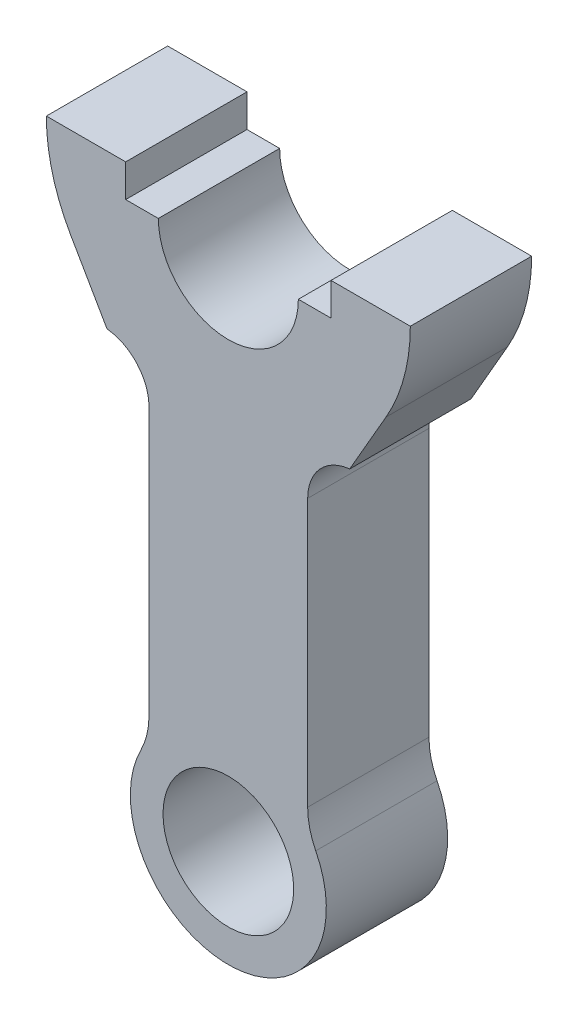
ISO-10303-21;
HEADER;
FILE_DESCRIPTION(('STEP AP214'),'2;1');
FILE_NAME('part.step','',(''),(''),'','','');
FILE_SCHEMA(('AUTOMOTIVE_DESIGN { 1 0 10303 214 1 1 1 1 }'));
ENDSEC;
DATA;
#1=APPLICATION_CONTEXT('core data for automotive mechanical design processes');
#2=APPLICATION_PROTOCOL_DEFINITION('international standard','automotive_design',2000,#1);
#3=PRODUCT_CONTEXT('',#1,'mechanical');
#4=PRODUCT('Part','Part','',(#3));
#5=PRODUCT_RELATED_PRODUCT_CATEGORY('part','',(#4));
#6=PRODUCT_DEFINITION_FORMATION('','',#4);
#7=PRODUCT_DEFINITION_CONTEXT('part definition',#1,'design');
#8=PRODUCT_DEFINITION('design','',#6,#7);
#9=PRODUCT_DEFINITION_SHAPE('','',#8);
#10=(LENGTH_UNIT() NAMED_UNIT(*) SI_UNIT(.MILLI.,.METRE.));
#11=(NAMED_UNIT(*) PLANE_ANGLE_UNIT() SI_UNIT($,.RADIAN.));
#12=(NAMED_UNIT(*) SI_UNIT($,.STERADIAN.) SOLID_ANGLE_UNIT());
#13=UNCERTAINTY_MEASURE_WITH_UNIT(LENGTH_MEASURE(1.E-05),#10,'distance_accuracy_value','');
#14=(GEOMETRIC_REPRESENTATION_CONTEXT(3) GLOBAL_UNCERTAINTY_ASSIGNED_CONTEXT((#13)) GLOBAL_UNIT_ASSIGNED_CONTEXT((#10,
#11,#12)) REPRESENTATION_CONTEXT('',''));
#15=CARTESIAN_POINT('',(0.,0.,0.));
#16=DIRECTION('',(0.,0.,1.));
#17=DIRECTION('',(1.,0.,0.));
#18=AXIS2_PLACEMENT_3D('',#15,#16,#17);
#19=CARTESIAN_POINT('',(0.,0.,13.));
#20=DIRECTION('',(0.,0.,1.));
#21=DIRECTION('',(1.,0.,0.));
#22=AXIS2_PLACEMENT_3D('',#19,#20,#21);
#23=PLANE('',#22);
#24=CARTESIAN_POINT('',(0.,0.,13.));
#25=DIRECTION('',(0.,0.,1.));
#26=DIRECTION('',(1.,0.,0.));
#27=AXIS2_PLACEMENT_3D('',#24,#25,#26);
#28=CIRCLE('',#27,39.);
#29=CARTESIAN_POINT('',(33.7957975443534,-19.463917086267,13.));
#30=VERTEX_POINT('',#29);
#31=CARTESIAN_POINT('',(39.,0.,13.));
#32=VERTEX_POINT('',#31);
#33=EDGE_CURVE('E177',#30,#32,#28,.T.);
#34=ORIENTED_EDGE('',*,*,#33,.T.);
#35=DIRECTION('',(-1.,0.,0.));
#36=VECTOR('',#35,1.);
#37=CARTESIAN_POINT('',(39.,0.,13.));
#38=LINE('',#37,#36);
#39=CARTESIAN_POINT('',(22.,0.,13.));
#40=VERTEX_POINT('',#39);
#41=EDGE_CURVE('E166',#32,#40,#38,.T.);
#42=ORIENTED_EDGE('',*,*,#41,.T.);
#43=DIRECTION('',(0.,-1.,0.));
#44=VECTOR('',#43,1.);
#45=CARTESIAN_POINT('',(22.,0.,13.));
#46=LINE('',#45,#44);
#47=CARTESIAN_POINT('',(22.,-7.,13.));
#48=VERTEX_POINT('',#47);
#49=EDGE_CURVE('E176',#40,#48,#46,.T.);
#50=ORIENTED_EDGE('',*,*,#49,.T.);
#51=DIRECTION('',(-1.,0.,0.));
#52=VECTOR('',#51,1.);
#53=CARTESIAN_POINT('',(22.,-7.,13.));
#54=LINE('',#53,#52);
#55=CARTESIAN_POINT('',(15.,-7.,13.));
#56=VERTEX_POINT('',#55);
#57=EDGE_CURVE('E292',#48,#56,#54,.T.);
#58=ORIENTED_EDGE('',*,*,#57,.T.);
#59=CARTESIAN_POINT('',(0.,-7.,13.));
#60=DIRECTION('',(0.,0.,-1.));
#61=DIRECTION('',(-1.,0.,0.));
#62=AXIS2_PLACEMENT_3D('',#59,#60,#61);
#63=CIRCLE('',#62,15.);
#64=CARTESIAN_POINT('',(-15.,-7.,13.));
#65=VERTEX_POINT('',#64);
#66=EDGE_CURVE('E337',#56,#65,#63,.T.);
#67=ORIENTED_EDGE('',*,*,#66,.T.);
#68=DIRECTION('',(-1.,0.,0.));
#69=VECTOR('',#68,1.);
#70=CARTESIAN_POINT('',(-22.,-7.,13.));
#71=LINE('',#70,#69);
#72=CARTESIAN_POINT('',(-22.,-7.,13.));
#73=VERTEX_POINT('',#72);
#74=EDGE_CURVE('E341',#65,#73,#71,.T.);
#75=ORIENTED_EDGE('',*,*,#74,.T.);
#76=DIRECTION('',(0.,1.,0.));
#77=VECTOR('',#76,1.);
#78=CARTESIAN_POINT('',(-22.,-7.,13.));
#79=LINE('',#78,#77);
#80=CARTESIAN_POINT('',(-22.,0.,13.));
#81=VERTEX_POINT('',#80);
#82=EDGE_CURVE('E322',#73,#81,#79,.T.);
#83=ORIENTED_EDGE('',*,*,#82,.T.);
#84=DIRECTION('',(-1.,0.,0.));
#85=VECTOR('',#84,1.);
#86=CARTESIAN_POINT('',(-22.,0.,13.));
#87=LINE('',#86,#85);
#88=CARTESIAN_POINT('',(-39.,0.,13.));
#89=VERTEX_POINT('',#88);
#90=EDGE_CURVE('E319',#81,#89,#87,.T.);
#91=ORIENTED_EDGE('',*,*,#90,.T.);
#92=CARTESIAN_POINT('',(0.,0.,13.));
#93=DIRECTION('',(0.,0.,1.));
#94=DIRECTION('',(1.,0.,0.));
#95=AXIS2_PLACEMENT_3D('',#92,#93,#94);
#96=CIRCLE('',#95,39.);
#97=CARTESIAN_POINT('',(-33.7957975443534,-19.463917086267,13.));
#98=VERTEX_POINT('',#97);
#99=EDGE_CURVE('E318',#89,#98,#96,.T.);
#100=ORIENTED_EDGE('',*,*,#99,.T.);
#101=DIRECTION('',(0.49907479708377,-0.866558911393676,0.));
#102=VECTOR('',#101,1.);
#103=CARTESIAN_POINT('',(-33.7957975443534,-19.463917086267,13.));
#104=LINE('',#103,#102);
#105=CARTESIAN_POINT('',(-26.,-33.,13.));
#106=VERTEX_POINT('',#105);
#107=EDGE_CURVE('E208',#98,#106,#104,.T.);
#108=ORIENTED_EDGE('',*,*,#107,.T.);
#109=CARTESIAN_POINT('',(-27.,-42.9498743710662,13.));
#110=DIRECTION('',(0.,0.,1.));
#111=DIRECTION('',(1.,0.,0.));
#112=AXIS2_PLACEMENT_3D('',#109,#110,#111);
#113=CIRCLE('',#112,10.);
#114=CARTESIAN_POINT('',(-17.,-42.9498743710662,13.));
#115=VERTEX_POINT('',#114);
#116=EDGE_CURVE('E202',#106,#115,#113,.F.);
#117=ORIENTED_EDGE('',*,*,#116,.T.);
#118=DIRECTION('',(0.,-1.,0.));
#119=VECTOR('',#118,1.);
#120=CARTESIAN_POINT('',(-17.,-33.,13.));
#121=LINE('',#120,#119);
#122=CARTESIAN_POINT('',(-17.,-100.266799469319,13.));
#123=VERTEX_POINT('',#122);
#124=EDGE_CURVE('E205',#115,#123,#121,.T.);
#125=ORIENTED_EDGE('',*,*,#124,.T.);
#126=CARTESIAN_POINT('',(-33.,-100.266799469319,13.));
#127=DIRECTION('',(0.,0.,-1.));
#128=DIRECTION('',(-1.,0.,0.));
#129=AXIS2_PLACEMENT_3D('',#126,#127,#128);
#130=CIRCLE('',#129,16.);
#131=CARTESIAN_POINT('',(-18.7297297297297,-107.502778077181,13.));
#132=VERTEX_POINT('',#131);
#133=EDGE_CURVE('E219',#123,#132,#130,.T.);
#134=ORIENTED_EDGE('',*,*,#133,.T.);
#135=CARTESIAN_POINT('',(0.,-117.,13.));
#136=DIRECTION('',(0.,0.,1.));
#137=DIRECTION('',(1.,0.,0.));
#138=AXIS2_PLACEMENT_3D('',#135,#136,#137);
#139=CIRCLE('',#138,21.);
#140=CARTESIAN_POINT('',(18.7297297297297,-107.502778077181,13.));
#141=VERTEX_POINT('',#140);
#142=EDGE_CURVE('E327',#132,#141,#139,.T.);
#143=ORIENTED_EDGE('',*,*,#142,.T.);
#144=CARTESIAN_POINT('',(33.,-100.266799469319,13.));
#145=DIRECTION('',(0.,0.,-1.));
#146=DIRECTION('',(1.,0.,0.));
#147=AXIS2_PLACEMENT_3D('',#144,#145,#146);
#148=CIRCLE('',#147,16.);
#149=CARTESIAN_POINT('',(17.,-100.266799469319,13.));
#150=VERTEX_POINT('',#149);
#151=EDGE_CURVE('E329',#141,#150,#148,.T.);
#152=ORIENTED_EDGE('',*,*,#151,.T.);
#153=DIRECTION('',(0.,1.,0.));
#154=VECTOR('',#153,1.);
#155=CARTESIAN_POINT('',(17.,-33.,13.));
#156=LINE('',#155,#154);
#157=CARTESIAN_POINT('',(17.,-42.9498743710662,13.));
#158=VERTEX_POINT('',#157);
#159=EDGE_CURVE('E331',#150,#158,#156,.T.);
#160=ORIENTED_EDGE('',*,*,#159,.T.);
#161=CARTESIAN_POINT('',(27.,-42.9498743710662,13.));
#162=DIRECTION('',(0.,0.,1.));
#163=DIRECTION('',(1.,0.,0.));
#164=AXIS2_PLACEMENT_3D('',#161,#162,#163);
#165=CIRCLE('',#164,10.);
#166=CARTESIAN_POINT('',(26.,-33.,13.));
#167=VERTEX_POINT('',#166);
#168=EDGE_CURVE('E11',#158,#167,#165,.F.);
#169=ORIENTED_EDGE('',*,*,#168,.T.);
#170=DIRECTION('',(0.499074797083771,0.866558911393676,0.));
#171=VECTOR('',#170,1.);
#172=CARTESIAN_POINT('',(33.7957975443534,-19.463917086267,13.));
#173=LINE('',#172,#171);
#174=EDGE_CURVE('E182',#167,#30,#173,.T.);
#175=ORIENTED_EDGE('',*,*,#174,.T.);
#176=EDGE_LOOP('',(#34,#42,#50,#58,#67,#75,#83,#91,#100,#108,#117,#125,#134,#143,#152,#160,#169,#175));
#177=FACE_BOUND('',#176,.T.);
#178=CARTESIAN_POINT('',(0.,-117.,13.));
#179=DIRECTION('',(0.,0.,1.));
#180=DIRECTION('',(1.,0.,0.));
#181=AXIS2_PLACEMENT_3D('',#178,#179,#180);
#182=CIRCLE('',#181,14.);
#183=CARTESIAN_POINT('',(-14.,-117.,13.));
#184=VERTEX_POINT('',#183);
#185=EDGE_CURVE('E334',#184,#184,#182,.T.);
#186=ORIENTED_EDGE('',*,*,#185,.F.);
#187=EDGE_LOOP('',(#186));
#188=FACE_BOUND('',#187,.T.);
#189=ADVANCED_FACE('F41',(#177,#188),#23,.T.);
#190=CARTESIAN_POINT('',(0.,0.,-13.));
#191=DIRECTION('',(0.,0.,1.));
#192=DIRECTION('',(1.,0.,0.));
#193=AXIS2_PLACEMENT_3D('',#190,#191,#192);
#194=PLANE('',#193);
#195=CARTESIAN_POINT('',(0.,0.,-13.));
#196=DIRECTION('',(0.,0.,1.));
#197=DIRECTION('',(1.,0.,0.));
#198=AXIS2_PLACEMENT_3D('',#195,#196,#197);
#199=CIRCLE('',#198,39.);
#200=CARTESIAN_POINT('',(33.7957975443534,-19.463917086267,-13.));
#201=VERTEX_POINT('',#200);
#202=CARTESIAN_POINT('',(39.,0.,-13.));
#203=VERTEX_POINT('',#202);
#204=EDGE_CURVE('E190',#201,#203,#199,.T.);
#205=ORIENTED_EDGE('',*,*,#204,.F.);
#206=DIRECTION('',(0.499074797083771,0.866558911393676,0.));
#207=VECTOR('',#206,1.);
#208=CARTESIAN_POINT('',(33.7957975443534,-19.463917086267,-13.));
#209=LINE('',#208,#207);
#210=CARTESIAN_POINT('',(26.,-33.,-13.));
#211=VERTEX_POINT('',#210);
#212=EDGE_CURVE('E186',#211,#201,#209,.T.);
#213=ORIENTED_EDGE('',*,*,#212,.F.);
#214=CARTESIAN_POINT('',(27.,-42.9498743710662,-13.));
#215=DIRECTION('',(0.,0.,1.));
#216=DIRECTION('',(1.,0.,0.));
#217=AXIS2_PLACEMENT_3D('',#214,#215,#216);
#218=CIRCLE('',#217,10.);
#219=CARTESIAN_POINT('',(17.,-42.9498743710662,-13.));
#220=VERTEX_POINT('',#219);
#221=EDGE_CURVE('E49',#211,#220,#218,.T.);
#222=ORIENTED_EDGE('',*,*,#221,.T.);
#223=DIRECTION('',(0.,1.,0.));
#224=VECTOR('',#223,1.);
#225=CARTESIAN_POINT('',(17.,-33.,-13.));
#226=LINE('',#225,#224);
#227=CARTESIAN_POINT('',(17.,-100.266799469319,-13.));
#228=VERTEX_POINT('',#227);
#229=EDGE_CURVE('E250',#228,#220,#226,.T.);
#230=ORIENTED_EDGE('',*,*,#229,.F.);
#231=CARTESIAN_POINT('',(33.,-100.266799469319,-13.));
#232=DIRECTION('',(0.,0.,-1.));
#233=DIRECTION('',(1.,0.,0.));
#234=AXIS2_PLACEMENT_3D('',#231,#232,#233);
#235=CIRCLE('',#234,16.);
#236=CARTESIAN_POINT('',(18.7297297297297,-107.502778077181,-13.));
#237=VERTEX_POINT('',#236);
#238=EDGE_CURVE('E248',#237,#228,#235,.T.);
#239=ORIENTED_EDGE('',*,*,#238,.F.);
#240=CARTESIAN_POINT('',(0.,-117.,-13.));
#241=DIRECTION('',(0.,0.,1.));
#242=DIRECTION('',(-1.,0.,0.));
#243=AXIS2_PLACEMENT_3D('',#240,#241,#242);
#244=CIRCLE('',#243,21.);
#245=CARTESIAN_POINT('',(-18.7297297297297,-107.502778077181,-13.));
#246=VERTEX_POINT('',#245);
#247=EDGE_CURVE('E246',#246,#237,#244,.T.);
#248=ORIENTED_EDGE('',*,*,#247,.F.);
#249=CARTESIAN_POINT('',(-33.,-100.266799469319,-13.));
#250=DIRECTION('',(0.,0.,-1.));
#251=DIRECTION('',(-1.,0.,0.));
#252=AXIS2_PLACEMENT_3D('',#249,#250,#251);
#253=CIRCLE('',#252,16.);
#254=CARTESIAN_POINT('',(-17.,-100.266799469319,-13.));
#255=VERTEX_POINT('',#254);
#256=EDGE_CURVE('E238',#255,#246,#253,.T.);
#257=ORIENTED_EDGE('',*,*,#256,.F.);
#258=DIRECTION('',(0.,-1.,0.));
#259=VECTOR('',#258,1.);
#260=CARTESIAN_POINT('',(-17.,-33.,-13.));
#261=LINE('',#260,#259);
#262=CARTESIAN_POINT('',(-17.,-42.9498743710662,-13.));
#263=VERTEX_POINT('',#262);
#264=EDGE_CURVE('E230',#263,#255,#261,.T.);
#265=ORIENTED_EDGE('',*,*,#264,.F.);
#266=CARTESIAN_POINT('',(-27.,-42.9498743710662,-13.));
#267=DIRECTION('',(0.,0.,1.));
#268=DIRECTION('',(1.,0.,0.));
#269=AXIS2_PLACEMENT_3D('',#266,#267,#268);
#270=CIRCLE('',#269,10.);
#271=CARTESIAN_POINT('',(-26.,-33.,-13.));
#272=VERTEX_POINT('',#271);
#273=EDGE_CURVE('E200',#263,#272,#270,.T.);
#274=ORIENTED_EDGE('',*,*,#273,.T.);
#275=DIRECTION('',(0.49907479708377,-0.866558911393676,0.));
#276=VECTOR('',#275,1.);
#277=CARTESIAN_POINT('',(-33.7957975443534,-19.463917086267,-13.));
#278=LINE('',#277,#276);
#279=CARTESIAN_POINT('',(-33.7957975443534,-19.463917086267,-13.));
#280=VERTEX_POINT('',#279);
#281=EDGE_CURVE('E228',#280,#272,#278,.T.);
#282=ORIENTED_EDGE('',*,*,#281,.F.);
#283=CARTESIAN_POINT('',(0.,0.,-13.));
#284=DIRECTION('',(0.,0.,1.));
#285=DIRECTION('',(1.,0.,0.));
#286=AXIS2_PLACEMENT_3D('',#283,#284,#285);
#287=CIRCLE('',#286,39.);
#288=CARTESIAN_POINT('',(-39.,0.,-13.));
#289=VERTEX_POINT('',#288);
#290=EDGE_CURVE('E236',#289,#280,#287,.T.);
#291=ORIENTED_EDGE('',*,*,#290,.F.);
#292=DIRECTION('',(-1.,0.,0.));
#293=VECTOR('',#292,1.);
#294=CARTESIAN_POINT('',(-22.,0.,-13.));
#295=LINE('',#294,#293);
#296=CARTESIAN_POINT('',(-22.,0.,-13.));
#297=VERTEX_POINT('',#296);
#298=EDGE_CURVE('E240',#297,#289,#295,.T.);
#299=ORIENTED_EDGE('',*,*,#298,.F.);
#300=DIRECTION('',(0.,1.,0.));
#301=VECTOR('',#300,1.);
#302=CARTESIAN_POINT('',(-22.,-7.,-13.));
#303=LINE('',#302,#301);
#304=CARTESIAN_POINT('',(-22.,-7.,-13.));
#305=VERTEX_POINT('',#304);
#306=EDGE_CURVE('E307',#305,#297,#303,.T.);
#307=ORIENTED_EDGE('',*,*,#306,.F.);
#308=DIRECTION('',(-1.,0.,0.));
#309=VECTOR('',#308,1.);
#310=CARTESIAN_POINT('',(-22.,-7.,-13.));
#311=LINE('',#310,#309);
#312=CARTESIAN_POINT('',(-15.,-7.,-13.));
#313=VERTEX_POINT('',#312);
#314=EDGE_CURVE('E300',#313,#305,#311,.T.);
#315=ORIENTED_EDGE('',*,*,#314,.F.);
#316=CARTESIAN_POINT('',(0.,-7.,-13.));
#317=DIRECTION('',(0.,0.,-1.));
#318=DIRECTION('',(-1.,0.,0.));
#319=AXIS2_PLACEMENT_3D('',#316,#317,#318);
#320=CIRCLE('',#319,15.);
#321=CARTESIAN_POINT('',(15.,-7.,-13.));
#322=VERTEX_POINT('',#321);
#323=EDGE_CURVE('E298',#322,#313,#320,.T.);
#324=ORIENTED_EDGE('',*,*,#323,.F.);
#325=DIRECTION('',(-1.,0.,0.));
#326=VECTOR('',#325,1.);
#327=CARTESIAN_POINT('',(22.,-7.,-13.));
#328=LINE('',#327,#326);
#329=CARTESIAN_POINT('',(22.,-7.,-13.));
#330=VERTEX_POINT('',#329);
#331=EDGE_CURVE('E291',#330,#322,#328,.T.);
#332=ORIENTED_EDGE('',*,*,#331,.F.);
#333=DIRECTION('',(0.,-1.,0.));
#334=VECTOR('',#333,1.);
#335=CARTESIAN_POINT('',(22.,0.,-13.));
#336=LINE('',#335,#334);
#337=CARTESIAN_POINT('',(22.,0.,-13.));
#338=VERTEX_POINT('',#337);
#339=EDGE_CURVE('E296',#338,#330,#336,.T.);
#340=ORIENTED_EDGE('',*,*,#339,.F.);
#341=DIRECTION('',(-1.,0.,0.));
#342=VECTOR('',#341,1.);
#343=CARTESIAN_POINT('',(39.,0.,-13.));
#344=LINE('',#343,#342);
#345=EDGE_CURVE('E302',#203,#338,#344,.T.);
#346=ORIENTED_EDGE('',*,*,#345,.F.);
#347=EDGE_LOOP('',(#205,#213,#222,#230,#239,#248,#257,#265,#274,#282,#291,#299,#307,#315,#324,
#332,#340,#346));
#348=FACE_BOUND('',#347,.T.);
#349=CARTESIAN_POINT('',(0.,-117.,-13.));
#350=DIRECTION('',(0.,0.,1.));
#351=DIRECTION('',(1.,0.,0.));
#352=AXIS2_PLACEMENT_3D('',#349,#350,#351);
#353=CIRCLE('',#352,14.);
#354=CARTESIAN_POINT('',(-14.,-117.,-13.));
#355=VERTEX_POINT('',#354);
#356=EDGE_CURVE('E589',#355,#355,#353,.T.);
#357=ORIENTED_EDGE('',*,*,#356,.T.);
#358=EDGE_LOOP('',(#357));
#359=FACE_BOUND('',#358,.T.);
#360=ADVANCED_FACE('F225',(#348,#359),#194,.F.);
#361=CARTESIAN_POINT('',(0.,0.,13.));
#362=DIRECTION('',(0.,0.,-1.));
#363=DIRECTION('',(-1.,0.,0.));
#364=AXIS2_PLACEMENT_3D('',#361,#362,#363);
#365=CYLINDRICAL_SURFACE('',#364,39.);
#366=ORIENTED_EDGE('',*,*,#204,.T.);
#367=DIRECTION('',(0.,0.,-1.));
#368=VECTOR('',#367,1.);
#369=CARTESIAN_POINT('',(39.,0.,13.));
#370=LINE('',#369,#368);
#371=EDGE_CURVE('E170',#32,#203,#370,.T.);
#372=ORIENTED_EDGE('',*,*,#371,.F.);
#373=ORIENTED_EDGE('',*,*,#33,.F.);
#374=DIRECTION('',(0.,0.,-1.));
#375=VECTOR('',#374,1.);
#376=CARTESIAN_POINT('',(33.7957975443534,-19.463917086267,13.));
#377=LINE('',#376,#375);
#378=EDGE_CURVE('E253',#30,#201,#377,.T.);
#379=ORIENTED_EDGE('',*,*,#378,.T.);
#380=EDGE_LOOP('',(#366,#372,#373,#379));
#381=FACE_BOUND('',#380,.T.);
#382=ADVANCED_FACE('F188',(#381),#365,.T.);
#383=CARTESIAN_POINT('',(39.,0.,13.));
#384=DIRECTION('',(0.,-1.,0.));
#385=DIRECTION('',(1.,0.,0.));
#386=AXIS2_PLACEMENT_3D('',#383,#384,#385);
#387=PLANE('',#386);
#388=ORIENTED_EDGE('',*,*,#345,.T.);
#389=DIRECTION('',(0.,0.,-1.));
#390=VECTOR('',#389,1.);
#391=CARTESIAN_POINT('',(22.,0.,13.));
#392=LINE('',#391,#390);
#393=EDGE_CURVE('E173',#40,#338,#392,.T.);
#394=ORIENTED_EDGE('',*,*,#393,.F.);
#395=ORIENTED_EDGE('',*,*,#41,.F.);
#396=ORIENTED_EDGE('',*,*,#371,.T.);
#397=EDGE_LOOP('',(#388,#394,#395,#396));
#398=FACE_BOUND('',#397,.T.);
#399=ADVANCED_FACE('F168',(#398),#387,.F.);
#400=CARTESIAN_POINT('',(22.,0.,13.));
#401=DIRECTION('',(1.,0.,0.));
#402=DIRECTION('',(0.,0.,-1.));
#403=AXIS2_PLACEMENT_3D('',#400,#401,#402);
#404=PLANE('',#403);
#405=ORIENTED_EDGE('',*,*,#339,.T.);
#406=DIRECTION('',(0.,0.,-1.));
#407=VECTOR('',#406,1.);
#408=CARTESIAN_POINT('',(22.,-7.,13.));
#409=LINE('',#408,#407);
#410=EDGE_CURVE('E195',#48,#330,#409,.T.);
#411=ORIENTED_EDGE('',*,*,#410,.F.);
#412=ORIENTED_EDGE('',*,*,#49,.F.);
#413=ORIENTED_EDGE('',*,*,#393,.T.);
#414=EDGE_LOOP('',(#405,#411,#412,#413));
#415=FACE_BOUND('',#414,.T.);
#416=ADVANCED_FACE('F335',(#415),#404,.F.);
#417=CARTESIAN_POINT('',(22.,-7.,13.));
#418=DIRECTION('',(0.,-1.,0.));
#419=DIRECTION('',(1.,0.,0.));
#420=AXIS2_PLACEMENT_3D('',#417,#418,#419);
#421=PLANE('',#420);
#422=ORIENTED_EDGE('',*,*,#331,.T.);
#423=DIRECTION('',(0.,0.,-1.));
#424=VECTOR('',#423,1.);
#425=CARTESIAN_POINT('',(15.,-7.,13.));
#426=LINE('',#425,#424);
#427=EDGE_CURVE('E282',#56,#322,#426,.T.);
#428=ORIENTED_EDGE('',*,*,#427,.F.);
#429=ORIENTED_EDGE('',*,*,#57,.F.);
#430=ORIENTED_EDGE('',*,*,#410,.T.);
#431=EDGE_LOOP('',(#422,#428,#429,#430));
#432=FACE_BOUND('',#431,.T.);
#433=ADVANCED_FACE('F289',(#432),#421,.F.);
#434=CARTESIAN_POINT('',(0.,-7.,13.));
#435=DIRECTION('',(0.,0.,-1.));
#436=DIRECTION('',(-1.,0.,0.));
#437=AXIS2_PLACEMENT_3D('',#434,#435,#436);
#438=CYLINDRICAL_SURFACE('',#437,15.);
#439=ORIENTED_EDGE('',*,*,#323,.T.);
#440=DIRECTION('',(0.,0.,-1.));
#441=VECTOR('',#440,1.);
#442=CARTESIAN_POINT('',(-15.,-7.,13.));
#443=LINE('',#442,#441);
#444=EDGE_CURVE('E279',#65,#313,#443,.T.);
#445=ORIENTED_EDGE('',*,*,#444,.F.);
#446=ORIENTED_EDGE('',*,*,#66,.F.);
#447=ORIENTED_EDGE('',*,*,#427,.T.);
#448=EDGE_LOOP('',(#439,#445,#446,#447));
#449=FACE_BOUND('',#448,.T.);
#450=ADVANCED_FACE('F352',(#449),#438,.F.);
#451=CARTESIAN_POINT('',(-22.,-7.,13.));
#452=DIRECTION('',(0.,-1.,0.));
#453=DIRECTION('',(1.,0.,0.));
#454=AXIS2_PLACEMENT_3D('',#451,#452,#453);
#455=PLANE('',#454);
#456=ORIENTED_EDGE('',*,*,#314,.T.);
#457=DIRECTION('',(0.,0.,-1.));
#458=VECTOR('',#457,1.);
#459=CARTESIAN_POINT('',(-22.,-7.,13.));
#460=LINE('',#459,#458);
#461=EDGE_CURVE('E276',#73,#305,#460,.T.);
#462=ORIENTED_EDGE('',*,*,#461,.F.);
#463=ORIENTED_EDGE('',*,*,#74,.F.);
#464=ORIENTED_EDGE('',*,*,#444,.T.);
#465=EDGE_LOOP('',(#456,#462,#463,#464));
#466=FACE_BOUND('',#465,.T.);
#467=ADVANCED_FACE('F348',(#466),#455,.F.);
#468=CARTESIAN_POINT('',(-22.,-7.,13.));
#469=DIRECTION('',(-1.,0.,0.));
#470=DIRECTION('',(0.,0.,1.));
#471=AXIS2_PLACEMENT_3D('',#468,#469,#470);
#472=PLANE('',#471);
#473=ORIENTED_EDGE('',*,*,#306,.T.);
#474=DIRECTION('',(0.,0.,-1.));
#475=VECTOR('',#474,1.);
#476=CARTESIAN_POINT('',(-22.,0.,13.));
#477=LINE('',#476,#475);
#478=EDGE_CURVE('E273',#81,#297,#477,.T.);
#479=ORIENTED_EDGE('',*,*,#478,.F.);
#480=ORIENTED_EDGE('',*,*,#82,.F.);
#481=ORIENTED_EDGE('',*,*,#461,.T.);
#482=EDGE_LOOP('',(#473,#479,#480,#481));
#483=FACE_BOUND('',#482,.T.);
#484=ADVANCED_FACE('F346',(#483),#472,.F.);
#485=CARTESIAN_POINT('',(-22.,0.,13.));
#486=DIRECTION('',(0.,-1.,0.));
#487=DIRECTION('',(1.,0.,0.));
#488=AXIS2_PLACEMENT_3D('',#485,#486,#487);
#489=PLANE('',#488);
#490=ORIENTED_EDGE('',*,*,#298,.T.);
#491=DIRECTION('',(0.,0.,-1.));
#492=VECTOR('',#491,1.);
#493=CARTESIAN_POINT('',(-39.,0.,13.));
#494=LINE('',#493,#492);
#495=EDGE_CURVE('E270',#89,#289,#494,.T.);
#496=ORIENTED_EDGE('',*,*,#495,.F.);
#497=ORIENTED_EDGE('',*,*,#90,.F.);
#498=ORIENTED_EDGE('',*,*,#478,.T.);
#499=EDGE_LOOP('',(#490,#496,#497,#498));
#500=FACE_BOUND('',#499,.T.);
#501=ADVANCED_FACE('F311',(#500),#489,.F.);
#502=CARTESIAN_POINT('',(0.,0.,13.));
#503=DIRECTION('',(0.,0.,-1.));
#504=DIRECTION('',(-1.,0.,0.));
#505=AXIS2_PLACEMENT_3D('',#502,#503,#504);
#506=CYLINDRICAL_SURFACE('',#505,39.);
#507=ORIENTED_EDGE('',*,*,#290,.T.);
#508=DIRECTION('',(0.,0.,-1.));
#509=VECTOR('',#508,1.);
#510=CARTESIAN_POINT('',(-33.7957975443534,-19.463917086267,13.));
#511=LINE('',#510,#509);
#512=EDGE_CURVE('E235',#98,#280,#511,.T.);
#513=ORIENTED_EDGE('',*,*,#512,.F.);
#514=ORIENTED_EDGE('',*,*,#99,.F.);
#515=ORIENTED_EDGE('',*,*,#495,.T.);
#516=EDGE_LOOP('',(#507,#513,#514,#515));
#517=FACE_BOUND('',#516,.T.);
#518=ADVANCED_FACE('F317',(#517),#506,.T.);
#519=CARTESIAN_POINT('',(-33.7957975443534,-19.463917086267,13.));
#520=DIRECTION('',(0.866558911393676,0.49907479708377,0.));
#521=DIRECTION('',(-0.49907479708377,0.866558911393677,0.));
#522=AXIS2_PLACEMENT_3D('',#519,#520,#521);
#523=PLANE('',#522);
#524=ORIENTED_EDGE('',*,*,#281,.T.);
#525=DIRECTION('',(0.,0.,-1.));
#526=VECTOR('',#525,1.);
#527=CARTESIAN_POINT('',(-26.,-33.,13.));
#528=LINE('',#527,#526);
#529=EDGE_CURVE('E222',#106,#272,#528,.T.);
#530=ORIENTED_EDGE('',*,*,#529,.F.);
#531=ORIENTED_EDGE('',*,*,#107,.F.);
#532=ORIENTED_EDGE('',*,*,#512,.T.);
#533=EDGE_LOOP('',(#524,#530,#531,#532));
#534=FACE_BOUND('',#533,.T.);
#535=ADVANCED_FACE('F233',(#534),#523,.F.);
#536=CARTESIAN_POINT('',(-17.,-33.,13.));
#537=DIRECTION('',(1.,0.,0.));
#538=DIRECTION('',(0.,1.,0.));
#539=AXIS2_PLACEMENT_3D('',#536,#537,#538);
#540=PLANE('',#539);
#541=ORIENTED_EDGE('',*,*,#124,.F.);
#542=DIRECTION('',(0.,0.,-1.));
#543=VECTOR('',#542,1.);
#544=CARTESIAN_POINT('',(-17.,-42.9498743710662,13.));
#545=LINE('',#544,#543);
#546=EDGE_CURVE('E191',#115,#263,#545,.T.);
#547=ORIENTED_EDGE('',*,*,#546,.T.);
#548=ORIENTED_EDGE('',*,*,#264,.T.);
#549=DIRECTION('',(0.,0.,-1.));
#550=VECTOR('',#549,1.);
#551=CARTESIAN_POINT('',(-17.,-100.266799469319,13.));
#552=LINE('',#551,#550);
#553=EDGE_CURVE('E217',#123,#255,#552,.T.);
#554=ORIENTED_EDGE('',*,*,#553,.F.);
#555=EDGE_LOOP('',(#541,#547,#548,#554));
#556=FACE_BOUND('',#555,.T.);
#557=ADVANCED_FACE('F214',(#556),#540,.F.);
#558=CARTESIAN_POINT('',(-33.,-100.266799469319,13.));
#559=DIRECTION('',(0.,0.,-1.));
#560=DIRECTION('',(-1.,0.,0.));
#561=AXIS2_PLACEMENT_3D('',#558,#559,#560);
#562=CYLINDRICAL_SURFACE('',#561,16.);
#563=ORIENTED_EDGE('',*,*,#256,.T.);
#564=DIRECTION('',(0.,0.,-1.));
#565=VECTOR('',#564,1.);
#566=CARTESIAN_POINT('',(-18.7297297297297,-107.502778077181,13.));
#567=LINE('',#566,#565);
#568=EDGE_CURVE('E264',#132,#246,#567,.T.);
#569=ORIENTED_EDGE('',*,*,#568,.F.);
#570=ORIENTED_EDGE('',*,*,#133,.F.);
#571=ORIENTED_EDGE('',*,*,#553,.T.);
#572=EDGE_LOOP('',(#563,#569,#570,#571));
#573=FACE_BOUND('',#572,.T.);
#574=ADVANCED_FACE('F384',(#573),#562,.F.);
#575=CARTESIAN_POINT('',(0.,-117.,13.));
#576=DIRECTION('',(0.,0.,-1.));
#577=DIRECTION('',(-1.,0.,0.));
#578=AXIS2_PLACEMENT_3D('',#575,#576,#577);
#579=CYLINDRICAL_SURFACE('',#578,21.);
#580=ORIENTED_EDGE('',*,*,#247,.T.);
#581=DIRECTION('',(0.,0.,-1.));
#582=VECTOR('',#581,1.);
#583=CARTESIAN_POINT('',(18.7297297297297,-107.502778077181,13.));
#584=LINE('',#583,#582);
#585=EDGE_CURVE('E261',#141,#237,#584,.T.);
#586=ORIENTED_EDGE('',*,*,#585,.F.);
#587=ORIENTED_EDGE('',*,*,#142,.F.);
#588=ORIENTED_EDGE('',*,*,#568,.T.);
#589=EDGE_LOOP('',(#580,#586,#587,#588));
#590=FACE_BOUND('',#589,.T.);
#591=ADVANCED_FACE('F380',(#590),#579,.T.);
#592=CARTESIAN_POINT('',(33.,-100.266799469319,13.));
#593=DIRECTION('',(0.,0.,-1.));
#594=DIRECTION('',(-1.,0.,0.));
#595=AXIS2_PLACEMENT_3D('',#592,#593,#594);
#596=CYLINDRICAL_SURFACE('',#595,16.);
#597=ORIENTED_EDGE('',*,*,#238,.T.);
#598=DIRECTION('',(0.,0.,-1.));
#599=VECTOR('',#598,1.);
#600=CARTESIAN_POINT('',(17.,-100.266799469319,13.));
#601=LINE('',#600,#599);
#602=EDGE_CURVE('E258',#150,#228,#601,.T.);
#603=ORIENTED_EDGE('',*,*,#602,.F.);
#604=ORIENTED_EDGE('',*,*,#151,.F.);
#605=ORIENTED_EDGE('',*,*,#585,.T.);
#606=EDGE_LOOP('',(#597,#603,#604,#605));
#607=FACE_BOUND('',#606,.T.);
#608=ADVANCED_FACE('F377',(#607),#596,.F.);
#609=CARTESIAN_POINT('',(17.,-33.,13.));
#610=DIRECTION('',(-1.,0.,0.));
#611=DIRECTION('',(0.,-1.,0.));
#612=AXIS2_PLACEMENT_3D('',#609,#610,#611);
#613=PLANE('',#612);
#614=ORIENTED_EDGE('',*,*,#229,.T.);
#615=DIRECTION('',(0.,0.,1.));
#616=VECTOR('',#615,1.);
#617=CARTESIAN_POINT('',(17.,-42.9498743710662,13.));
#618=LINE('',#617,#616);
#619=EDGE_CURVE('E56',#220,#158,#618,.T.);
#620=ORIENTED_EDGE('',*,*,#619,.T.);
#621=ORIENTED_EDGE('',*,*,#159,.F.);
#622=ORIENTED_EDGE('',*,*,#602,.T.);
#623=EDGE_LOOP('',(#614,#620,#621,#622));
#624=FACE_BOUND('',#623,.T.);
#625=ADVANCED_FACE('F373',(#624),#613,.F.);
#626=CARTESIAN_POINT('',(33.7957975443534,-19.463917086267,13.));
#627=DIRECTION('',(-0.866558911393676,0.499074797083771,0.));
#628=DIRECTION('',(-0.499074797083771,-0.866558911393676,0.));
#629=AXIS2_PLACEMENT_3D('',#626,#627,#628);
#630=PLANE('',#629);
#631=ORIENTED_EDGE('',*,*,#212,.T.);
#632=ORIENTED_EDGE('',*,*,#378,.F.);
#633=ORIENTED_EDGE('',*,*,#174,.F.);
#634=DIRECTION('',(0.,0.,-1.));
#635=VECTOR('',#634,1.);
#636=CARTESIAN_POINT('',(26.,-33.,13.));
#637=LINE('',#636,#635);
#638=EDGE_CURVE('E255',#167,#211,#637,.T.);
#639=ORIENTED_EDGE('',*,*,#638,.T.);
#640=EDGE_LOOP('',(#631,#632,#633,#639));
#641=FACE_BOUND('',#640,.T.);
#642=ADVANCED_FACE('F370',(#641),#630,.F.);
#643=CARTESIAN_POINT('',(0.,-117.,13.));
#644=DIRECTION('',(0.,0.,-1.));
#645=DIRECTION('',(-1.,0.,0.));
#646=AXIS2_PLACEMENT_3D('',#643,#644,#645);
#647=CYLINDRICAL_SURFACE('',#646,14.);
#648=CARTESIAN_POINT('',(-14.,-117.,13.));
#649=CARTESIAN_POINT('',(-14.,-117.,12.7291666666667));
#650=CARTESIAN_POINT('',(-14.,-117.,12.4583333333333));
#651=CARTESIAN_POINT('',(-14.,-117.,11.9166666666667));
#652=CARTESIAN_POINT('',(-14.,-117.,11.6458333333333));
#653=CARTESIAN_POINT('',(-14.,-117.,11.1041666666667));
#654=CARTESIAN_POINT('',(-14.,-117.,10.8333333333333));
#655=CARTESIAN_POINT('',(-14.,-117.,10.2916666666667));
#656=CARTESIAN_POINT('',(-14.,-117.,10.0208333333333));
#657=CARTESIAN_POINT('',(-14.,-117.,9.47916666666667));
#658=CARTESIAN_POINT('',(-14.,-117.,9.20833333333333));
#659=CARTESIAN_POINT('',(-14.,-117.,8.66666666666667));
#660=CARTESIAN_POINT('',(-14.,-117.,8.39583333333333));
#661=CARTESIAN_POINT('',(-14.,-117.,7.85416666666667));
#662=CARTESIAN_POINT('',(-14.,-117.,7.58333333333333));
#663=CARTESIAN_POINT('',(-14.,-117.,7.04166666666667));
#664=CARTESIAN_POINT('',(-14.,-117.,6.77083333333333));
#665=CARTESIAN_POINT('',(-14.,-117.,6.22916666666667));
#666=CARTESIAN_POINT('',(-14.,-117.,5.95833333333333));
#667=CARTESIAN_POINT('',(-14.,-117.,5.41666666666667));
#668=CARTESIAN_POINT('',(-14.,-117.,5.14583333333333));
#669=CARTESIAN_POINT('',(-14.,-117.,4.60416666666667));
#670=CARTESIAN_POINT('',(-14.,-117.,4.33333333333333));
#671=CARTESIAN_POINT('',(-14.,-117.,3.79166666666667));
#672=CARTESIAN_POINT('',(-14.,-117.,3.52083333333333));
#673=CARTESIAN_POINT('',(-14.,-117.,2.97916666666667));
#674=CARTESIAN_POINT('',(-14.,-117.,2.70833333333333));
#675=CARTESIAN_POINT('',(-14.,-117.,2.16666666666667));
#676=CARTESIAN_POINT('',(-14.,-117.,1.89583333333333));
#677=CARTESIAN_POINT('',(-14.,-117.,1.35416666666667));
#678=CARTESIAN_POINT('',(-14.,-117.,1.08333333333333));
#679=CARTESIAN_POINT('',(-14.,-117.,0.541666666666667));
#680=CARTESIAN_POINT('',(-14.,-117.,0.270833333333333));
#681=CARTESIAN_POINT('',(-14.,-117.,-0.270833333333333));
#682=CARTESIAN_POINT('',(-14.,-117.,-0.541666666666667));
#683=CARTESIAN_POINT('',(-14.,-117.,-1.08333333333333));
#684=CARTESIAN_POINT('',(-14.,-117.,-1.35416666666667));
#685=CARTESIAN_POINT('',(-14.,-117.,-1.89583333333333));
#686=CARTESIAN_POINT('',(-14.,-117.,-2.16666666666667));
#687=CARTESIAN_POINT('',(-14.,-117.,-2.70833333333333));
#688=CARTESIAN_POINT('',(-14.,-117.,-2.97916666666667));
#689=CARTESIAN_POINT('',(-14.,-117.,-3.52083333333333));
#690=CARTESIAN_POINT('',(-14.,-117.,-3.79166666666667));
#691=CARTESIAN_POINT('',(-14.,-117.,-4.33333333333333));
#692=CARTESIAN_POINT('',(-14.,-117.,-4.60416666666667));
#693=CARTESIAN_POINT('',(-14.,-117.,-5.14583333333333));
#694=CARTESIAN_POINT('',(-14.,-117.,-5.41666666666667));
#695=CARTESIAN_POINT('',(-14.,-117.,-5.95833333333333));
#696=CARTESIAN_POINT('',(-14.,-117.,-6.22916666666667));
#697=CARTESIAN_POINT('',(-14.,-117.,-6.77083333333333));
#698=CARTESIAN_POINT('',(-14.,-117.,-7.04166666666667));
#699=CARTESIAN_POINT('',(-14.,-117.,-7.58333333333333));
#700=CARTESIAN_POINT('',(-14.,-117.,-7.85416666666667));
#701=CARTESIAN_POINT('',(-14.,-117.,-8.39583333333333));
#702=CARTESIAN_POINT('',(-14.,-117.,-8.66666666666667));
#703=CARTESIAN_POINT('',(-14.,-117.,-9.20833333333333));
#704=CARTESIAN_POINT('',(-14.,-117.,-9.47916666666667));
#705=CARTESIAN_POINT('',(-14.,-117.,-10.0208333333333));
#706=CARTESIAN_POINT('',(-14.,-117.,-10.2916666666667));
#707=CARTESIAN_POINT('',(-14.,-117.,-10.8333333333333));
#708=CARTESIAN_POINT('',(-14.,-117.,-11.1041666666667));
#709=CARTESIAN_POINT('',(-14.,-117.,-11.6458333333333));
#710=CARTESIAN_POINT('',(-14.,-117.,-11.9166666666667));
#711=CARTESIAN_POINT('',(-14.,-117.,-12.4583333333333));
#712=CARTESIAN_POINT('',(-14.,-117.,-12.7291666666667));
#713=CARTESIAN_POINT('',(-14.,-117.,-13.));
#714=B_SPLINE_CURVE_WITH_KNOTS('',3,(#648,#649,#650,#651,#652,#653,#654,#655,#656,#657,#658,
#659,#660,#661,#662,#663,#664,#665,#666,#667,#668,#669,#670,#671,#672,#673,#674,#675,#676,#677,
#678,#679,#680,#681,#682,#683,#684,#685,#686,#687,#688,#689,#690,#691,#692,#693,#694,#695,#696,
#697,#698,#699,#700,#701,#702,#703,#704,#705,#706,#707,#708,#709,#710,#711,#712,#713),
.UNSPECIFIED.,.F.,.F.,(4,2,2,2,2,2,2,2,2,2,2,2,2,2,2,2,2,2,2,2,2,2,2,2,2,2,2,2,2,2,2,2,4),(0.,
0.812500000000001,1.625,2.4375,3.25,4.0625,4.875,5.6875,6.5,7.3125,8.125,8.9375,9.75,10.5625,
11.375,12.1875,13.,13.8125,14.625,15.4375,16.25,17.0625,17.875,18.6875,19.5,20.3125,21.125,
21.9375,22.75,23.5625,24.375,25.1875,26.),.UNSPECIFIED.);
#715=EDGE_CURVE('BSEAM368',#184,#355,#714,.T.);
#716=ORIENTED_EDGE('',*,*,#185,.T.);
#717=ORIENTED_EDGE('',*,*,#356,.F.);
#718=ORIENTED_EDGE('',*,*,#715,.T.);
#719=ORIENTED_EDGE('',*,*,#715,.F.);
#720=EDGE_LOOP('',(#716,#718,#717,#719));
#721=FACE_BOUND('',#720,.T.);
#722=ADVANCED_FACE('F368',(#721),#647,.F.);
#723=CARTESIAN_POINT('',(-27.,-42.9498743710662,13.));
#724=DIRECTION('',(0.,0.,-1.));
#725=DIRECTION('',(-1.,0.,0.));
#726=AXIS2_PLACEMENT_3D('',#723,#724,#725);
#727=CYLINDRICAL_SURFACE('',#726,10.);
#728=ORIENTED_EDGE('',*,*,#116,.F.);
#729=ORIENTED_EDGE('',*,*,#529,.T.);
#730=ORIENTED_EDGE('',*,*,#273,.F.);
#731=ORIENTED_EDGE('',*,*,#546,.F.);
#732=EDGE_LOOP('',(#728,#729,#730,#731));
#733=FACE_BOUND('',#732,.T.);
#734=ADVANCED_FACE('F221',(#733),#727,.F.);
#735=CARTESIAN_POINT('',(27.,-42.9498743710662,13.));
#736=DIRECTION('',(0.,0.,1.));
#737=DIRECTION('',(1.,0.,0.));
#738=AXIS2_PLACEMENT_3D('',#735,#736,#737);
#739=CYLINDRICAL_SURFACE('',#738,10.);
#740=ORIENTED_EDGE('',*,*,#168,.F.);
#741=ORIENTED_EDGE('',*,*,#619,.F.);
#742=ORIENTED_EDGE('',*,*,#221,.F.);
#743=ORIENTED_EDGE('',*,*,#638,.F.);
#744=EDGE_LOOP('',(#740,#741,#742,#743));
#745=FACE_BOUND('',#744,.T.);
#746=ADVANCED_FACE('F43',(#745),#739,.F.);
#747=CLOSED_SHELL('',(#189,#360,#382,#399,#416,#433,#450,#467,#484,#501,#518,#535,#557,#574,
#591,#608,#625,#642,#722,#734,#746));
#748=MANIFOLD_SOLID_BREP('B2',#747);
#749=ADVANCED_BREP_SHAPE_REPRESENTATION('',(#18,#748),#14);
#750=SHAPE_DEFINITION_REPRESENTATION(#9,#749);
ENDSEC;
END-ISO-10303-21;
